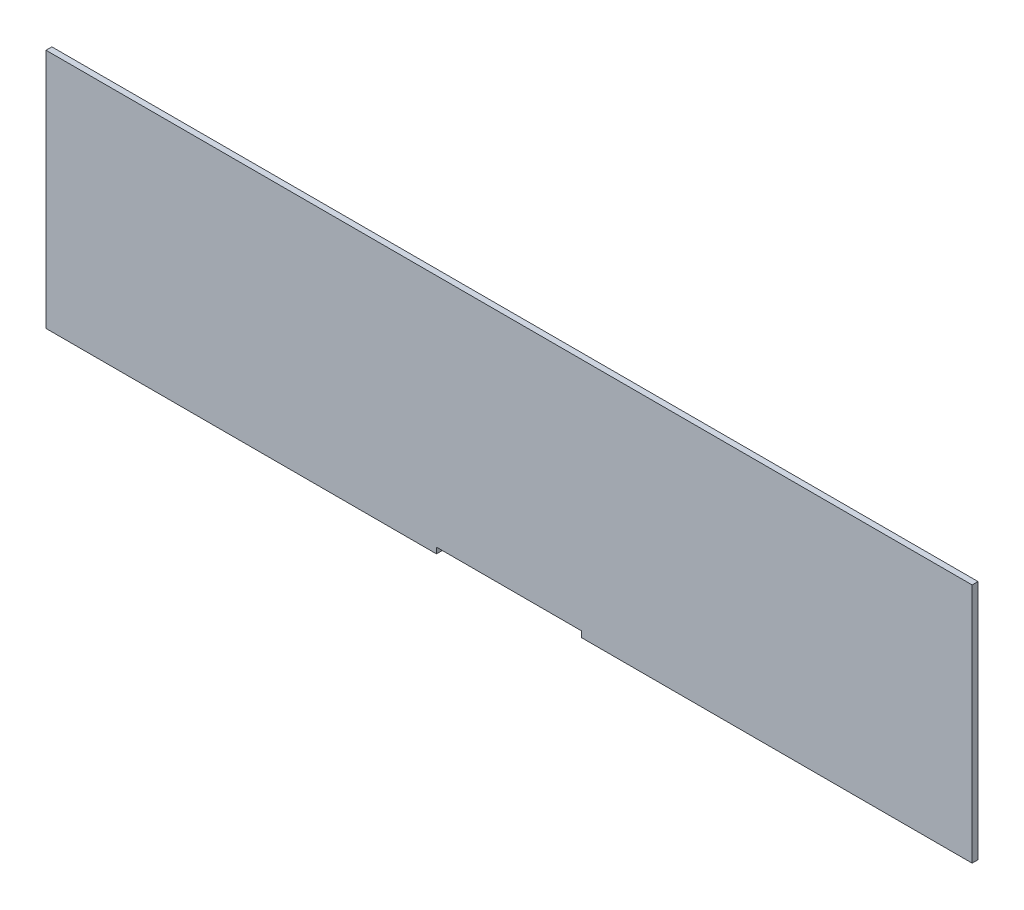
ISO-10303-21;
HEADER;
FILE_DESCRIPTION(('STEP AP214'),'2;1');
FILE_NAME('part.step','',(''),(''),'','','');
FILE_SCHEMA(('AUTOMOTIVE_DESIGN { 1 0 10303 214 1 1 1 1 }'));
ENDSEC;
DATA;
#1=APPLICATION_CONTEXT('core data for automotive mechanical design processes');
#2=APPLICATION_PROTOCOL_DEFINITION('international standard','automotive_design',2000,#1);
#3=PRODUCT_CONTEXT('',#1,'mechanical');
#4=PRODUCT('Part','Part','',(#3));
#5=PRODUCT_RELATED_PRODUCT_CATEGORY('part','',(#4));
#6=PRODUCT_DEFINITION_FORMATION('','',#4);
#7=PRODUCT_DEFINITION_CONTEXT('part definition',#1,'design');
#8=PRODUCT_DEFINITION('design','',#6,#7);
#9=PRODUCT_DEFINITION_SHAPE('','',#8);
#10=(LENGTH_UNIT() NAMED_UNIT(*) SI_UNIT(.MILLI.,.METRE.));
#11=(NAMED_UNIT(*) PLANE_ANGLE_UNIT() SI_UNIT($,.RADIAN.));
#12=(NAMED_UNIT(*) SI_UNIT($,.STERADIAN.) SOLID_ANGLE_UNIT());
#13=UNCERTAINTY_MEASURE_WITH_UNIT(LENGTH_MEASURE(1.E-05),#10,'distance_accuracy_value','');
#14=(GEOMETRIC_REPRESENTATION_CONTEXT(3) GLOBAL_UNCERTAINTY_ASSIGNED_CONTEXT((#13)) GLOBAL_UNIT_ASSIGNED_CONTEXT((#10,
#11,#12)) REPRESENTATION_CONTEXT('',''));
#15=CARTESIAN_POINT('',(0.,0.,0.));
#16=DIRECTION('',(0.,0.,1.));
#17=DIRECTION('',(1.,0.,0.));
#18=AXIS2_PLACEMENT_3D('',#15,#16,#17);
#19=CARTESIAN_POINT('',(-236.355,123.,3.));
#20=DIRECTION('',(1.,0.,0.));
#21=DIRECTION('',(0.,1.,0.));
#22=AXIS2_PLACEMENT_3D('',#19,#20,#21);
#23=PLANE('',#22);
#24=DIRECTION('',(0.,-1.,0.));
#25=VECTOR('',#24,1.);
#26=CARTESIAN_POINT('',(-236.355,123.,0.));
#27=LINE('',#26,#25);
#28=CARTESIAN_POINT('',(-236.355,123.,0.));
#29=VERTEX_POINT('',#28);
#30=CARTESIAN_POINT('',(-236.355,0.,0.));
#31=VERTEX_POINT('',#30);
#32=EDGE_CURVE('E144',#29,#31,#27,.T.);
#33=ORIENTED_EDGE('',*,*,#32,.T.);
#34=DIRECTION('',(0.,0.,-1.));
#35=VECTOR('',#34,1.);
#36=CARTESIAN_POINT('',(-236.355,0.,3.));
#37=LINE('',#36,#35);
#38=CARTESIAN_POINT('',(-236.355,0.,3.));
#39=VERTEX_POINT('',#38);
#40=EDGE_CURVE('E11',#39,#31,#37,.T.);
#41=ORIENTED_EDGE('',*,*,#40,.F.);
#42=DIRECTION('',(0.,-1.,0.));
#43=VECTOR('',#42,1.);
#44=CARTESIAN_POINT('',(-236.355,123.,3.));
#45=LINE('',#44,#43);
#46=CARTESIAN_POINT('',(-236.355,123.,3.));
#47=VERTEX_POINT('',#46);
#48=EDGE_CURVE('E166',#47,#39,#45,.T.);
#49=ORIENTED_EDGE('',*,*,#48,.F.);
#50=DIRECTION('',(0.,0.,-1.));
#51=VECTOR('',#50,1.);
#52=CARTESIAN_POINT('',(-236.355,123.,3.));
#53=LINE('',#52,#51);
#54=EDGE_CURVE('E140',#47,#29,#53,.T.);
#55=ORIENTED_EDGE('',*,*,#54,.T.);
#56=EDGE_LOOP('',(#33,#41,#49,#55));
#57=FACE_BOUND('',#56,.T.);
#58=ADVANCED_FACE('F43',(#57),#23,.F.);
#59=CARTESIAN_POINT('',(-236.355,0.,3.));
#60=DIRECTION('',(0.,1.,0.));
#61=DIRECTION('',(0.,0.,1.));
#62=AXIS2_PLACEMENT_3D('',#59,#60,#61);
#63=PLANE('',#62);
#64=DIRECTION('',(1.,0.,0.));
#65=VECTOR('',#64,1.);
#66=CARTESIAN_POINT('',(-236.355,0.,0.));
#67=LINE('',#66,#65);
#68=CARTESIAN_POINT('',(-37.055,0.,0.));
#69=VERTEX_POINT('',#68);
#70=EDGE_CURVE('E148',#31,#69,#67,.T.);
#71=ORIENTED_EDGE('',*,*,#70,.T.);
#72=DIRECTION('',(0.,0.,-1.));
#73=VECTOR('',#72,1.);
#74=CARTESIAN_POINT('',(-37.055,0.,3.));
#75=LINE('',#74,#73);
#76=CARTESIAN_POINT('',(-37.055,0.,3.));
#77=VERTEX_POINT('',#76);
#78=EDGE_CURVE('E52',#77,#69,#75,.T.);
#79=ORIENTED_EDGE('',*,*,#78,.F.);
#80=DIRECTION('',(1.,0.,0.));
#81=VECTOR('',#80,1.);
#82=CARTESIAN_POINT('',(-236.355,0.,3.));
#83=LINE('',#82,#81);
#84=EDGE_CURVE('E103',#39,#77,#83,.T.);
#85=ORIENTED_EDGE('',*,*,#84,.F.);
#86=ORIENTED_EDGE('',*,*,#40,.T.);
#87=EDGE_LOOP('',(#71,#79,#85,#86));
#88=FACE_BOUND('',#87,.T.);
#89=ADVANCED_FACE('F212',(#88),#63,.F.);
#90=CARTESIAN_POINT('',(-37.055,2.99999999999999,3.));
#91=DIRECTION('',(-1.,0.,0.));
#92=DIRECTION('',(0.,-1.,0.));
#93=AXIS2_PLACEMENT_3D('',#90,#91,#92);
#94=PLANE('',#93);
#95=DIRECTION('',(0.,1.,0.));
#96=VECTOR('',#95,1.);
#97=CARTESIAN_POINT('',(-37.055,2.99999999999999,0.));
#98=LINE('',#97,#96);
#99=CARTESIAN_POINT('',(-37.055,2.99999999999999,0.));
#100=VERTEX_POINT('',#99);
#101=EDGE_CURVE('E151',#69,#100,#98,.T.);
#102=ORIENTED_EDGE('',*,*,#101,.T.);
#103=DIRECTION('',(0.,0.,-1.));
#104=VECTOR('',#103,1.);
#105=CARTESIAN_POINT('',(-37.055,2.99999999999999,3.));
#106=LINE('',#105,#104);
#107=CARTESIAN_POINT('',(-37.055,2.99999999999999,3.));
#108=VERTEX_POINT('',#107);
#109=EDGE_CURVE('E177',#108,#100,#106,.T.);
#110=ORIENTED_EDGE('',*,*,#109,.F.);
#111=DIRECTION('',(0.,1.,0.));
#112=VECTOR('',#111,1.);
#113=CARTESIAN_POINT('',(-37.055,2.99999999999999,3.));
#114=LINE('',#113,#112);
#115=EDGE_CURVE('E187',#77,#108,#114,.T.);
#116=ORIENTED_EDGE('',*,*,#115,.F.);
#117=ORIENTED_EDGE('',*,*,#78,.T.);
#118=EDGE_LOOP('',(#102,#110,#116,#117));
#119=FACE_BOUND('',#118,.T.);
#120=ADVANCED_FACE('F185',(#119),#94,.F.);
#121=CARTESIAN_POINT('',(-37.055,2.99999999999999,3.));
#122=DIRECTION('',(0.,1.,0.));
#123=DIRECTION('',(-1.,0.,0.));
#124=AXIS2_PLACEMENT_3D('',#121,#122,#123);
#125=PLANE('',#124);
#126=DIRECTION('',(1.,0.,0.));
#127=VECTOR('',#126,1.);
#128=CARTESIAN_POINT('',(-37.055,2.99999999999999,0.));
#129=LINE('',#128,#127);
#130=CARTESIAN_POINT('',(37.055,3.00000000000001,0.));
#131=VERTEX_POINT('',#130);
#132=EDGE_CURVE('E154',#100,#131,#129,.T.);
#133=ORIENTED_EDGE('',*,*,#132,.T.);
#134=DIRECTION('',(0.,0.,-1.));
#135=VECTOR('',#134,1.);
#136=CARTESIAN_POINT('',(37.055,3.00000000000001,3.));
#137=LINE('',#136,#135);
#138=CARTESIAN_POINT('',(37.055,3.00000000000001,3.));
#139=VERTEX_POINT('',#138);
#140=EDGE_CURVE('E173',#139,#131,#137,.T.);
#141=ORIENTED_EDGE('',*,*,#140,.F.);
#142=DIRECTION('',(1.,0.,0.));
#143=VECTOR('',#142,1.);
#144=CARTESIAN_POINT('',(-37.055,2.99999999999999,3.));
#145=LINE('',#144,#143);
#146=EDGE_CURVE('E200',#108,#139,#145,.T.);
#147=ORIENTED_EDGE('',*,*,#146,.F.);
#148=ORIENTED_EDGE('',*,*,#109,.T.);
#149=EDGE_LOOP('',(#133,#141,#147,#148));
#150=FACE_BOUND('',#149,.T.);
#151=ADVANCED_FACE('F195',(#150),#125,.F.);
#152=CARTESIAN_POINT('',(37.055,3.00000000000001,3.));
#153=DIRECTION('',(1.,0.,0.));
#154=DIRECTION('',(0.,1.,0.));
#155=AXIS2_PLACEMENT_3D('',#152,#153,#154);
#156=PLANE('',#155);
#157=DIRECTION('',(0.,-1.,0.));
#158=VECTOR('',#157,1.);
#159=CARTESIAN_POINT('',(37.055,3.00000000000001,0.));
#160=LINE('',#159,#158);
#161=CARTESIAN_POINT('',(37.055,0.,0.));
#162=VERTEX_POINT('',#161);
#163=EDGE_CURVE('E157',#131,#162,#160,.T.);
#164=ORIENTED_EDGE('',*,*,#163,.T.);
#165=DIRECTION('',(0.,0.,-1.));
#166=VECTOR('',#165,1.);
#167=CARTESIAN_POINT('',(37.055,0.,3.));
#168=LINE('',#167,#166);
#169=CARTESIAN_POINT('',(37.055,0.,3.));
#170=VERTEX_POINT('',#169);
#171=EDGE_CURVE('E133',#170,#162,#168,.T.);
#172=ORIENTED_EDGE('',*,*,#171,.F.);
#173=DIRECTION('',(0.,-1.,0.));
#174=VECTOR('',#173,1.);
#175=CARTESIAN_POINT('',(37.055,3.00000000000001,3.));
#176=LINE('',#175,#174);
#177=EDGE_CURVE('E122',#139,#170,#176,.T.);
#178=ORIENTED_EDGE('',*,*,#177,.F.);
#179=ORIENTED_EDGE('',*,*,#140,.T.);
#180=EDGE_LOOP('',(#164,#172,#178,#179));
#181=FACE_BOUND('',#180,.T.);
#182=ADVANCED_FACE('F198',(#181),#156,.F.);
#183=CARTESIAN_POINT('',(37.055,0.,3.));
#184=DIRECTION('',(0.,1.,0.));
#185=DIRECTION('',(-1.,0.,0.));
#186=AXIS2_PLACEMENT_3D('',#183,#184,#185);
#187=PLANE('',#186);
#188=DIRECTION('',(1.,0.,0.));
#189=VECTOR('',#188,1.);
#190=CARTESIAN_POINT('',(37.055,0.,0.));
#191=LINE('',#190,#189);
#192=CARTESIAN_POINT('',(236.355,0.,0.));
#193=VERTEX_POINT('',#192);
#194=EDGE_CURVE('E131',#162,#193,#191,.T.);
#195=ORIENTED_EDGE('',*,*,#194,.T.);
#196=DIRECTION('',(0.,0.,-1.));
#197=VECTOR('',#196,1.);
#198=CARTESIAN_POINT('',(236.355,0.,3.));
#199=LINE('',#198,#197);
#200=CARTESIAN_POINT('',(236.355,0.,3.));
#201=VERTEX_POINT('',#200);
#202=EDGE_CURVE('E128',#201,#193,#199,.T.);
#203=ORIENTED_EDGE('',*,*,#202,.F.);
#204=DIRECTION('',(1.,0.,0.));
#205=VECTOR('',#204,1.);
#206=CARTESIAN_POINT('',(37.055,0.,3.));
#207=LINE('',#206,#205);
#208=EDGE_CURVE('E116',#170,#201,#207,.T.);
#209=ORIENTED_EDGE('',*,*,#208,.F.);
#210=ORIENTED_EDGE('',*,*,#171,.T.);
#211=EDGE_LOOP('',(#195,#203,#209,#210));
#212=FACE_BOUND('',#211,.T.);
#213=ADVANCED_FACE('F129',(#212),#187,.F.);
#214=CARTESIAN_POINT('',(236.355,123.,3.));
#215=DIRECTION('',(-1.,0.,0.));
#216=DIRECTION('',(0.,-1.,0.));
#217=AXIS2_PLACEMENT_3D('',#214,#215,#216);
#218=PLANE('',#217);
#219=DIRECTION('',(0.,1.,0.));
#220=VECTOR('',#219,1.);
#221=CARTESIAN_POINT('',(236.355,123.,0.));
#222=LINE('',#221,#220);
#223=CARTESIAN_POINT('',(236.355,123.,0.));
#224=VERTEX_POINT('',#223);
#225=EDGE_CURVE('E89',#193,#224,#222,.T.);
#226=ORIENTED_EDGE('',*,*,#225,.T.);
#227=DIRECTION('',(0.,0.,-1.));
#228=VECTOR('',#227,1.);
#229=CARTESIAN_POINT('',(236.355,123.,3.));
#230=LINE('',#229,#228);
#231=CARTESIAN_POINT('',(236.355,123.,3.));
#232=VERTEX_POINT('',#231);
#233=EDGE_CURVE('E134',#232,#224,#230,.T.);
#234=ORIENTED_EDGE('',*,*,#233,.F.);
#235=DIRECTION('',(0.,1.,0.));
#236=VECTOR('',#235,1.);
#237=CARTESIAN_POINT('',(236.355,123.,3.));
#238=LINE('',#237,#236);
#239=EDGE_CURVE('E120',#201,#232,#238,.T.);
#240=ORIENTED_EDGE('',*,*,#239,.F.);
#241=ORIENTED_EDGE('',*,*,#202,.T.);
#242=EDGE_LOOP('',(#226,#234,#240,#241));
#243=FACE_BOUND('',#242,.T.);
#244=ADVANCED_FACE('F136',(#243),#218,.F.);
#245=CARTESIAN_POINT('',(-236.355,123.,3.));
#246=DIRECTION('',(0.,-1.,0.));
#247=DIRECTION('',(0.,0.,-1.));
#248=AXIS2_PLACEMENT_3D('',#245,#246,#247);
#249=PLANE('',#248);
#250=DIRECTION('',(-1.,0.,0.));
#251=VECTOR('',#250,1.);
#252=CARTESIAN_POINT('',(-236.355,123.,0.));
#253=LINE('',#252,#251);
#254=EDGE_CURVE('E95',#224,#29,#253,.T.);
#255=ORIENTED_EDGE('',*,*,#254,.T.);
#256=ORIENTED_EDGE('',*,*,#54,.F.);
#257=DIRECTION('',(-1.,0.,0.));
#258=VECTOR('',#257,1.);
#259=CARTESIAN_POINT('',(-236.355,123.,3.));
#260=LINE('',#259,#258);
#261=EDGE_CURVE('E60',#232,#47,#260,.T.);
#262=ORIENTED_EDGE('',*,*,#261,.F.);
#263=ORIENTED_EDGE('',*,*,#233,.T.);
#264=EDGE_LOOP('',(#255,#256,#262,#263));
#265=FACE_BOUND('',#264,.T.);
#266=ADVANCED_FACE('F228',(#265),#249,.F.);
#267=CARTESIAN_POINT('',(0.,0.,3.));
#268=DIRECTION('',(0.,0.,1.));
#269=DIRECTION('',(1.,0.,0.));
#270=AXIS2_PLACEMENT_3D('',#267,#268,#269);
#271=PLANE('',#270);
#272=ORIENTED_EDGE('',*,*,#48,.T.);
#273=ORIENTED_EDGE('',*,*,#84,.T.);
#274=ORIENTED_EDGE('',*,*,#115,.T.);
#275=ORIENTED_EDGE('',*,*,#146,.T.);
#276=ORIENTED_EDGE('',*,*,#177,.T.);
#277=ORIENTED_EDGE('',*,*,#208,.T.);
#278=ORIENTED_EDGE('',*,*,#239,.T.);
#279=ORIENTED_EDGE('',*,*,#261,.T.);
#280=EDGE_LOOP('',(#272,#273,#274,#275,#276,#277,#278,#279));
#281=FACE_BOUND('',#280,.T.);
#282=ADVANCED_FACE('F118',(#281),#271,.T.);
#283=CARTESIAN_POINT('',(0.,0.,0.));
#284=DIRECTION('',(0.,0.,1.));
#285=DIRECTION('',(1.,0.,0.));
#286=AXIS2_PLACEMENT_3D('',#283,#284,#285);
#287=PLANE('',#286);
#288=ORIENTED_EDGE('',*,*,#32,.F.);
#289=ORIENTED_EDGE('',*,*,#254,.F.);
#290=ORIENTED_EDGE('',*,*,#225,.F.);
#291=ORIENTED_EDGE('',*,*,#194,.F.);
#292=ORIENTED_EDGE('',*,*,#163,.F.);
#293=ORIENTED_EDGE('',*,*,#132,.F.);
#294=ORIENTED_EDGE('',*,*,#101,.F.);
#295=ORIENTED_EDGE('',*,*,#70,.F.);
#296=EDGE_LOOP('',(#288,#289,#290,#291,#292,#293,#294,#295));
#297=FACE_BOUND('',#296,.T.);
#298=ADVANCED_FACE('F191',(#297),#287,.F.);
#299=CLOSED_SHELL('',(#58,#89,#120,#151,#182,#213,#244,#266,#282,#298));
#300=MANIFOLD_SOLID_BREP('B2',#299);
#301=ADVANCED_BREP_SHAPE_REPRESENTATION('',(#18,#300),#14);
#302=SHAPE_DEFINITION_REPRESENTATION(#9,#301);
ENDSEC;
END-ISO-10303-21;
